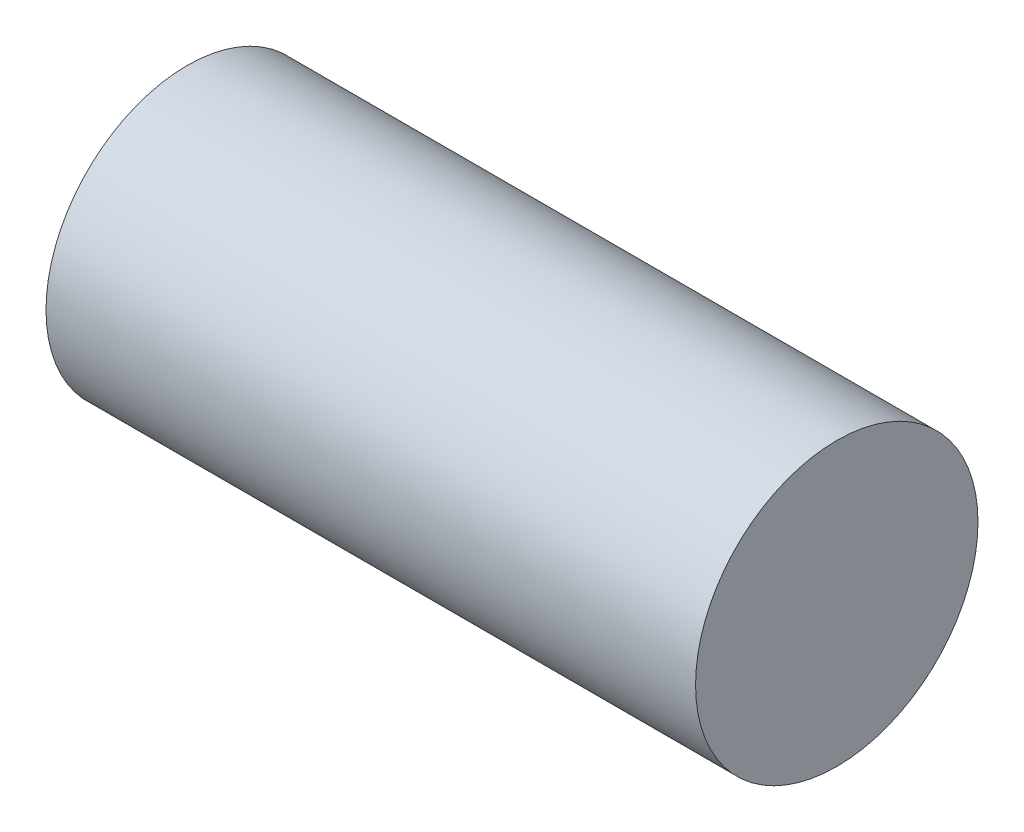
ISO-10303-21;
HEADER;
FILE_DESCRIPTION(('STEP AP214'),'2;1');
FILE_NAME('part.step','',(''),(''),'','','');
FILE_SCHEMA(('AUTOMOTIVE_DESIGN { 1 0 10303 214 1 1 1 1 }'));
ENDSEC;
DATA;
#1=APPLICATION_CONTEXT('core data for automotive mechanical design processes');
#2=APPLICATION_PROTOCOL_DEFINITION('international standard','automotive_design',2000,#1);
#3=PRODUCT_CONTEXT('',#1,'mechanical');
#4=PRODUCT('Part','Part','',(#3));
#5=PRODUCT_RELATED_PRODUCT_CATEGORY('part','',(#4));
#6=PRODUCT_DEFINITION_FORMATION('','',#4);
#7=PRODUCT_DEFINITION_CONTEXT('part definition',#1,'design');
#8=PRODUCT_DEFINITION('design','',#6,#7);
#9=PRODUCT_DEFINITION_SHAPE('','',#8);
#10=(LENGTH_UNIT() NAMED_UNIT(*) SI_UNIT(.MILLI.,.METRE.));
#11=(NAMED_UNIT(*) PLANE_ANGLE_UNIT() SI_UNIT($,.RADIAN.));
#12=(NAMED_UNIT(*) SI_UNIT($,.STERADIAN.) SOLID_ANGLE_UNIT());
#13=UNCERTAINTY_MEASURE_WITH_UNIT(LENGTH_MEASURE(1.E-05),#10,'distance_accuracy_value','');
#14=(GEOMETRIC_REPRESENTATION_CONTEXT(3) GLOBAL_UNCERTAINTY_ASSIGNED_CONTEXT((#13)) GLOBAL_UNIT_ASSIGNED_CONTEXT((#10,
#11,#12)) REPRESENTATION_CONTEXT('',''));
#15=CARTESIAN_POINT('',(0.,0.,0.));
#16=DIRECTION('',(0.,0.,1.));
#17=DIRECTION('',(1.,0.,0.));
#18=AXIS2_PLACEMENT_3D('',#15,#16,#17);
#19=CARTESIAN_POINT('',(9.2,0.,0.));
#20=DIRECTION('',(-1.,0.,0.));
#21=DIRECTION('',(0.,0.,1.));
#22=AXIS2_PLACEMENT_3D('',#19,#20,#21);
#23=CYLINDRICAL_SURFACE('',#22,2.);
#24=CARTESIAN_POINT('',(9.2,0.,0.));
#25=DIRECTION('',(1.,0.,0.));
#26=DIRECTION('',(0.,0.,-1.));
#27=AXIS2_PLACEMENT_3D('',#24,#25,#26);
#28=CIRCLE('',#27,2.);
#29=CARTESIAN_POINT('',(9.2,0.,-2.));
#30=VERTEX_POINT('',#29);
#31=EDGE_CURVE('E10',#30,#30,#28,.T.);
#32=ORIENTED_EDGE('',*,*,#31,.F.);
#33=EDGE_LOOP('',(#32));
#34=FACE_BOUND('',#33,.T.);
#35=CARTESIAN_POINT('',(0.,0.,0.));
#36=DIRECTION('',(1.,0.,0.));
#37=DIRECTION('',(0.,0.,-1.));
#38=AXIS2_PLACEMENT_3D('',#35,#36,#37);
#39=CIRCLE('',#38,2.);
#40=CARTESIAN_POINT('',(0.,0.,-2.));
#41=VERTEX_POINT('',#40);
#42=EDGE_CURVE('E34',#41,#41,#39,.T.);
#43=ORIENTED_EDGE('',*,*,#42,.T.);
#44=EDGE_LOOP('',(#43));
#45=FACE_BOUND('',#44,.T.);
#46=ADVANCED_FACE('F31',(#34,#45),#23,.T.);
#47=CARTESIAN_POINT('',(9.2,0.,0.));
#48=DIRECTION('',(1.,0.,0.));
#49=DIRECTION('',(0.,0.,-1.));
#50=AXIS2_PLACEMENT_3D('',#47,#48,#49);
#51=PLANE('',#50);
#52=ORIENTED_EDGE('',*,*,#31,.T.);
#53=EDGE_LOOP('',(#52));
#54=FACE_BOUND('',#53,.T.);
#55=ADVANCED_FACE('F46',(#54),#51,.T.);
#56=CARTESIAN_POINT('',(0.,0.,0.));
#57=DIRECTION('',(1.,0.,0.));
#58=DIRECTION('',(0.,0.,-1.));
#59=AXIS2_PLACEMENT_3D('',#56,#57,#58);
#60=PLANE('',#59);
#61=ORIENTED_EDGE('',*,*,#42,.F.);
#62=EDGE_LOOP('',(#61));
#63=FACE_BOUND('',#62,.T.);
#64=ADVANCED_FACE('F44',(#63),#60,.F.);
#65=CLOSED_SHELL('',(#46,#55,#64));
#66=MANIFOLD_SOLID_BREP('B2',#65);
#67=ADVANCED_BREP_SHAPE_REPRESENTATION('',(#18,#66),#14);
#68=SHAPE_DEFINITION_REPRESENTATION(#9,#67);
ENDSEC;
END-ISO-10303-21;
